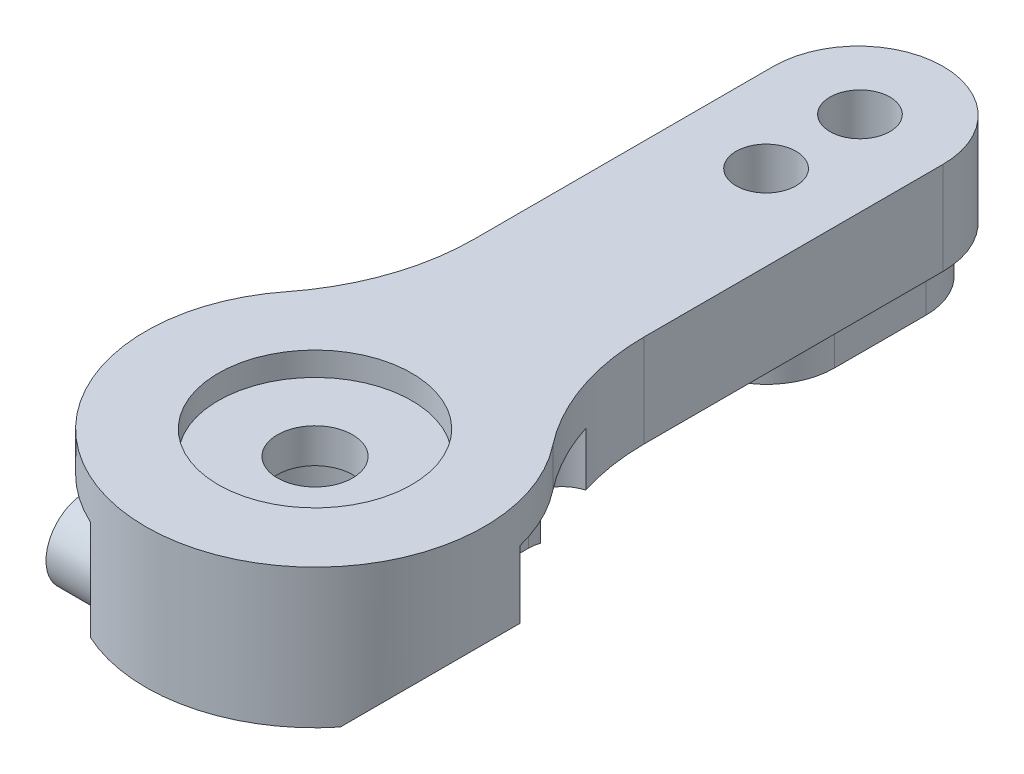
ISO-10303-21;
HEADER;
FILE_DESCRIPTION(('STEP AP214'),'2;1');
FILE_NAME('part.step','',(''),(''),'','','');
FILE_SCHEMA(('AUTOMOTIVE_DESIGN { 1 0 10303 214 1 1 1 1 }'));
ENDSEC;
DATA;
#1=APPLICATION_CONTEXT('core data for automotive mechanical design processes');
#2=APPLICATION_PROTOCOL_DEFINITION('international standard','automotive_design',2000,#1);
#3=PRODUCT_CONTEXT('',#1,'mechanical');
#4=PRODUCT('Part','Part','',(#3));
#5=PRODUCT_RELATED_PRODUCT_CATEGORY('part','',(#4));
#6=PRODUCT_DEFINITION_FORMATION('','',#4);
#7=PRODUCT_DEFINITION_CONTEXT('part definition',#1,'design');
#8=PRODUCT_DEFINITION('design','',#6,#7);
#9=PRODUCT_DEFINITION_SHAPE('','',#8);
#10=(LENGTH_UNIT() NAMED_UNIT(*) SI_UNIT(.MILLI.,.METRE.));
#11=(NAMED_UNIT(*) PLANE_ANGLE_UNIT() SI_UNIT($,.RADIAN.));
#12=(NAMED_UNIT(*) SI_UNIT($,.STERADIAN.) SOLID_ANGLE_UNIT());
#13=UNCERTAINTY_MEASURE_WITH_UNIT(LENGTH_MEASURE(1.E-05),#10,'distance_accuracy_value','');
#14=(GEOMETRIC_REPRESENTATION_CONTEXT(3) GLOBAL_UNCERTAINTY_ASSIGNED_CONTEXT((#13)) GLOBAL_UNIT_ASSIGNED_CONTEXT((#10,
#11,#12)) REPRESENTATION_CONTEXT('',''));
#15=CARTESIAN_POINT('',(0.,0.,0.));
#16=DIRECTION('',(0.,0.,1.));
#17=DIRECTION('',(1.,0.,0.));
#18=AXIS2_PLACEMENT_3D('',#15,#16,#17);
#19=CARTESIAN_POINT('',(-4.635,4.42,3.29740358857448));
#20=DIRECTION('',(0.,-1.,0.));
#21=DIRECTION('',(0.,0.,-1.));
#22=AXIS2_PLACEMENT_3D('',#19,#20,#21);
#23=CYLINDRICAL_SURFACE('',#22,1.5);
#24=CARTESIAN_POINT('',(-3.135,2.37563142999579,3.29740358857448));
#25=CARTESIAN_POINT('',(-3.13499929063332,2.35098734940492,3.29079812653025));
#26=CARTESIAN_POINT('',(-3.13501076060452,2.32619946416548,3.2847292713313));
#27=CARTESIAN_POINT('',(-3.13505593108993,2.27638334594961,3.2736746323766));
#28=CARTESIAN_POINT('',(-3.13508963162104,2.25135511279069,3.26868884944323));
#29=CARTESIAN_POINT('',(-3.1351771351546,2.20110555970957,3.25981021609176));
#30=CARTESIAN_POINT('',(-3.1352309381876,2.17588423949419,3.25591736733339));
#31=CARTESIAN_POINT('',(-3.13536928706567,2.12529609720727,3.24923184705765));
#32=CARTESIAN_POINT('',(-3.13545383298078,2.09992927480443,3.24643917804637));
#33=CARTESIAN_POINT('',(-3.13561323409808,2.04909860768838,3.24195932813421));
#34=CARTESIAN_POINT('',(-3.13568808927085,2.02363476268074,3.24027215059089));
#35=CARTESIAN_POINT('',(-3.13597920321424,1.9726562761898,3.23800646686057));
#36=CARTESIAN_POINT('',(-3.1361954625217,1.94714163451402,3.23742796488258));
#37=CARTESIAN_POINT('',(-3.13620055637309,1.92108625176765,3.2374038399132));
#38=CARTESIAN_POINT('',(-3.13620056680338,1.92054312652284,3.23740358850619));
#39=CARTESIAN_POINT('',(-3.13619646691662,1.89477615854863,3.23740359174605));
#40=CARTESIAN_POINT('',(-3.13598356368196,1.86954956056594,3.237945990029));
#41=CARTESIAN_POINT('',(-3.13569268980616,1.8186280810411,3.24013682474229));
#42=CARTESIAN_POINT('',(-3.13561757173885,1.79293418928827,3.24180768425076));
#43=CARTESIAN_POINT('',(-3.13545721413209,1.7416749322182,3.24627218493815));
#44=CARTESIAN_POINT('',(-3.1353719869119,1.71610944924568,3.24906446923085));
#45=CARTESIAN_POINT('',(-3.13523260986903,1.66515617498853,3.2557623679507));
#46=CARTESIAN_POINT('',(-3.13517842265874,1.63976820646996,3.259666634471));
#47=CARTESIAN_POINT('',(-3.13509030285911,1.58921794481394,3.26857710349415));
#48=CARTESIAN_POINT('',(-3.13505634588633,1.56405541614981,3.27358196944118));
#49=CARTESIAN_POINT('',(-3.13501084968834,1.51400331526107,3.28467963063528));
#50=CARTESIAN_POINT('',(-3.13499928342199,1.48911344992846,3.29077110386569));
#51=CARTESIAN_POINT('',(-3.135,1.46436857000421,3.29740358857448));
#52=B_SPLINE_CURVE_WITH_KNOTS('',3,(#24,#25,#26,#27,#28,#29,#30,#31,#32,#33,#34,#35,#36,#37,#38,
#39,#40,#41,#42,#43,#44,#45,#46,#47,#48,#49,#50,#51),.UNSPECIFIED.,.F.,.F.,(4,2,2,2,2,2,2,2,2,2,
2,2,2,4),(0.,0.076535864251509,0.153071786616124,0.22960782520736,0.306144038138464,
0.38268048352229,0.459217219471158,0.46084659773949,0.536518061710102,0.613739201524309,
0.690867186509442,0.767902074613317,0.844843923994357,0.921692793022475),.UNSPECIFIED.);
#53=CARTESIAN_POINT('',(-3.135,2.37563142999579,3.29740358857448));
#54=VERTEX_POINT('',#53);
#55=CARTESIAN_POINT('',(-3.135,1.46436857000421,3.29740358857448));
#56=VERTEX_POINT('',#55);
#57=EDGE_CURVE('E11',#54,#56,#52,.T.);
#58=ORIENTED_EDGE('',*,*,#57,.F.);
#59=DIRECTION('',(0.,-1.,0.));
#60=VECTOR('',#59,1.);
#61=CARTESIAN_POINT('',(-3.135,4.42,3.29740358857448));
#62=LINE('',#61,#60);
#63=CARTESIAN_POINT('',(-3.135,4.42,3.29740358857448));
#64=VERTEX_POINT('',#63);
#65=EDGE_CURVE('E197',#64,#54,#62,.T.);
#66=ORIENTED_EDGE('',*,*,#65,.F.);
#67=CARTESIAN_POINT('',(-4.635,4.42,3.29740358857448));
#68=DIRECTION('',(0.,-1.,0.));
#69=DIRECTION('',(0.,0.,-1.));
#70=AXIS2_PLACEMENT_3D('',#67,#68,#69);
#71=CIRCLE('',#70,1.5);
#72=CARTESIAN_POINT('',(-4.635,4.42,1.79740358857448));
#73=VERTEX_POINT('',#72);
#74=EDGE_CURVE('E463',#73,#64,#71,.T.);
#75=ORIENTED_EDGE('',*,*,#74,.F.);
#76=DIRECTION('',(0.,-1.,0.));
#77=VECTOR('',#76,1.);
#78=CARTESIAN_POINT('',(-4.635,4.42,1.79740358857448));
#79=LINE('',#78,#77);
#80=CARTESIAN_POINT('',(-4.635,0.,1.79740358857448));
#81=VERTEX_POINT('',#80);
#82=EDGE_CURVE('E198',#73,#81,#79,.T.);
#83=ORIENTED_EDGE('',*,*,#82,.T.);
#84=CARTESIAN_POINT('',(-4.635,0.,3.29740358857448));
#85=DIRECTION('',(0.,-1.,0.));
#86=DIRECTION('',(0.,0.,-1.));
#87=AXIS2_PLACEMENT_3D('',#84,#85,#86);
#88=CIRCLE('',#87,1.5);
#89=CARTESIAN_POINT('',(-3.135,0.,3.29740358857448));
#90=VERTEX_POINT('',#89);
#91=EDGE_CURVE('E194',#81,#90,#88,.T.);
#92=ORIENTED_EDGE('',*,*,#91,.T.);
#93=EDGE_CURVE('E40',#56,#90,#62,.T.);
#94=ORIENTED_EDGE('',*,*,#93,.F.);
#95=EDGE_LOOP('',(#58,#66,#75,#83,#92,#94));
#96=FACE_BOUND('',#95,.T.);
#97=ADVANCED_FACE('F36',(#96),#23,.F.);
#98=CARTESIAN_POINT('',(0.,0.,0.));
#99=DIRECTION('',(0.,1.,0.));
#100=DIRECTION('',(0.,0.,1.));
#101=AXIS2_PLACEMENT_3D('',#98,#99,#100);
#102=CYLINDRICAL_SURFACE('',#101,1.66);
#103=CARTESIAN_POINT('',(0.,5.1,0.));
#104=DIRECTION('',(0.,1.,0.));
#105=DIRECTION('',(0.,0.,1.));
#106=AXIS2_PLACEMENT_3D('',#103,#104,#105);
#107=CIRCLE('',#106,1.66);
#108=CARTESIAN_POINT('',(0.,5.1,1.66));
#109=VERTEX_POINT('',#108);
#110=EDGE_CURVE('E321',#109,#109,#107,.T.);
#111=ORIENTED_EDGE('',*,*,#110,.T.);
#112=EDGE_LOOP('',(#111));
#113=FACE_BOUND('',#112,.T.);
#114=CARTESIAN_POINT('',(0.,3.57,0.));
#115=DIRECTION('',(0.,-1.,0.));
#116=DIRECTION('',(0.,0.,-1.));
#117=AXIS2_PLACEMENT_3D('',#114,#115,#116);
#118=CIRCLE('',#117,1.66);
#119=CARTESIAN_POINT('',(0.,3.57,-1.66));
#120=VERTEX_POINT('',#119);
#121=EDGE_CURVE('E422',#120,#120,#118,.F.);
#122=ORIENTED_EDGE('',*,*,#121,.F.);
#123=EDGE_LOOP('',(#122));
#124=FACE_BOUND('',#123,.T.);
#125=ADVANCED_FACE('F265',(#113,#124),#102,.F.);
#126=CARTESIAN_POINT('',(0.,2.05,0.));
#127=DIRECTION('',(0.,-1.,0.));
#128=DIRECTION('',(0.,0.,-1.));
#129=AXIS2_PLACEMENT_3D('',#126,#127,#128);
#130=CYLINDRICAL_SURFACE('',#129,7.485);
#131=CARTESIAN_POINT('',(0.,2.05,0.));
#132=DIRECTION('',(0.,1.,0.));
#133=DIRECTION('',(0.,0.,1.));
#134=AXIS2_PLACEMENT_3D('',#131,#132,#133);
#135=CIRCLE('',#134,7.485);
#136=CARTESIAN_POINT('',(3.20885580441953,2.05,-6.76228285613987));
#137=VERTEX_POINT('',#136);
#138=CARTESIAN_POINT('',(-5.88611667143266,2.05,-4.62372744982688));
#139=VERTEX_POINT('',#138);
#140=EDGE_CURVE('E383',#137,#139,#135,.T.);
#141=ORIENTED_EDGE('',*,*,#140,.F.);
#142=DIRECTION('',(0.,-1.,0.));
#143=VECTOR('',#142,1.);
#144=CARTESIAN_POINT('',(3.20885580441953,2.21,-6.76228285613987));
#145=LINE('',#144,#143);
#146=CARTESIAN_POINT('',(3.20885580441953,0.,-6.76228285613987));
#147=VERTEX_POINT('',#146);
#148=EDGE_CURVE('E296',#137,#147,#145,.T.);
#149=ORIENTED_EDGE('',*,*,#148,.T.);
#150=CARTESIAN_POINT('',(0.,0.,0.));
#151=DIRECTION('',(0.,1.,0.));
#152=DIRECTION('',(0.,0.,1.));
#153=AXIS2_PLACEMENT_3D('',#150,#151,#152);
#154=CIRCLE('',#153,7.485);
#155=CARTESIAN_POINT('',(-5.82329906421162,0.,-4.70259641142552));
#156=VERTEX_POINT('',#155);
#157=EDGE_CURVE('E386',#147,#156,#154,.T.);
#158=ORIENTED_EDGE('',*,*,#157,.T.);
#159=CARTESIAN_POINT('',(0.,-5.82329906421164,0.));
#160=DIRECTION('',(-0.707106781186549,-0.707106781186546,0.));
#161=DIRECTION('',(0.707106781186546,-0.707106781186549,0.));
#162=AXIS2_PLACEMENT_3D('',#159,#160,#161);
#163=ELLIPSE('',#162,10.5853885143626,7.485);
#164=CARTESIAN_POINT('',(-7.26598687996198,1.44268781575037,1.79740358857448));
#165=VERTEX_POINT('',#164);
#166=EDGE_CURVE('E302',#165,#156,#163,.T.);
#167=ORIENTED_EDGE('',*,*,#166,.F.);
#168=DIRECTION('',(0.,-1.,0.));
#169=VECTOR('',#168,1.);
#170=CARTESIAN_POINT('',(-7.26598687996198,2.05,1.79740358857448));
#171=LINE('',#170,#169);
#172=CARTESIAN_POINT('',(-7.26598687996198,4.42,1.79740358857448));
#173=VERTEX_POINT('',#172);
#174=EDGE_CURVE('E285',#165,#173,#171,.F.);
#175=ORIENTED_EDGE('',*,*,#174,.T.);
#176=CARTESIAN_POINT('',(0.,4.42,0.));
#177=DIRECTION('',(0.,-1.,0.));
#178=DIRECTION('',(0.,0.,-1.));
#179=AXIS2_PLACEMENT_3D('',#176,#177,#178);
#180=CIRCLE('',#179,7.485);
#181=CARTESIAN_POINT('',(-3.135,4.42,6.79683749989655));
#182=VERTEX_POINT('',#181);
#183=EDGE_CURVE('E46',#182,#173,#180,.T.);
#184=ORIENTED_EDGE('',*,*,#183,.F.);
#185=DIRECTION('',(0.,-1.,0.));
#186=VECTOR('',#185,1.);
#187=CARTESIAN_POINT('',(-3.135,2.05,6.79683749989655));
#188=LINE('',#187,#186);
#189=CARTESIAN_POINT('',(-3.135,0.,6.79683749989655));
#190=VERTEX_POINT('',#189);
#191=EDGE_CURVE('E299',#182,#190,#188,.T.);
#192=ORIENTED_EDGE('',*,*,#191,.T.);
#193=CARTESIAN_POINT('',(5.82329906421162,0.,4.70259641142551));
#194=VERTEX_POINT('',#193);
#195=EDGE_CURVE('E380',#190,#194,#154,.T.);
#196=ORIENTED_EDGE('',*,*,#195,.T.);
#197=CARTESIAN_POINT('',(0.,-5.82329906421164,0.));
#198=DIRECTION('',(-0.707106781186549,0.707106781186546,0.));
#199=DIRECTION('',(-0.707106781186546,-0.707106781186549,0.));
#200=AXIS2_PLACEMENT_3D('',#197,#198,#199);
#201=ELLIPSE('',#200,10.5853885143626,7.485);
#202=CARTESIAN_POINT('',(7.26598687996198,1.44268781575037,-1.79740358857448));
#203=VERTEX_POINT('',#202);
#204=EDGE_CURVE('E305',#194,#203,#201,.T.);
#205=ORIENTED_EDGE('',*,*,#204,.T.);
#206=DIRECTION('',(0.,-1.,0.));
#207=VECTOR('',#206,1.);
#208=CARTESIAN_POINT('',(7.26598687996197,2.05,-1.79740358857449));
#209=LINE('',#208,#207);
#210=CARTESIAN_POINT('',(7.26598687996197,4.42,-1.79740358857449));
#211=VERTEX_POINT('',#210);
#212=EDGE_CURVE('E60',#203,#211,#209,.F.);
#213=ORIENTED_EDGE('',*,*,#212,.T.);
#214=CARTESIAN_POINT('',(0.,4.42,0.));
#215=DIRECTION('',(0.,1.,0.));
#216=DIRECTION('',(0.,0.,1.));
#217=AXIS2_PLACEMENT_3D('',#214,#215,#216);
#218=CIRCLE('',#217,7.485);
#219=CARTESIAN_POINT('',(5.88611667143266,4.42,-4.62372744982688));
#220=VERTEX_POINT('',#219);
#221=EDGE_CURVE('E290',#211,#220,#218,.T.);
#222=ORIENTED_EDGE('',*,*,#221,.T.);
#223=DIRECTION('',(0.,-1.,0.));
#224=VECTOR('',#223,1.);
#225=CARTESIAN_POINT('',(5.88611667143266,2.05,-4.62372744982688));
#226=LINE('',#225,#224);
#227=CARTESIAN_POINT('',(5.88611667143266,6.15,-4.62372744982688));
#228=VERTEX_POINT('',#227);
#229=EDGE_CURVE('E385',#220,#228,#226,.F.);
#230=ORIENTED_EDGE('',*,*,#229,.T.);
#231=CARTESIAN_POINT('',(0.,6.15,0.));
#232=DIRECTION('',(0.,1.,0.));
#233=DIRECTION('',(0.,0.,1.));
#234=AXIS2_PLACEMENT_3D('',#231,#232,#233);
#235=CIRCLE('',#234,7.485);
#236=CARTESIAN_POINT('',(-5.88611667143266,6.15,-4.62372744982688));
#237=VERTEX_POINT('',#236);
#238=EDGE_CURVE('E368',#237,#228,#235,.T.);
#239=ORIENTED_EDGE('',*,*,#238,.F.);
#240=DIRECTION('',(0.,-1.,0.));
#241=VECTOR('',#240,1.);
#242=CARTESIAN_POINT('',(-5.88611667143266,2.05,-4.62372744982688));
#243=LINE('',#242,#241);
#244=EDGE_CURVE('E389',#237,#139,#243,.T.);
#245=ORIENTED_EDGE('',*,*,#244,.T.);
#246=EDGE_LOOP('',(#141,#149,#158,#167,#175,#184,#192,#196,#205,#213,#222,#230,#239,#245));
#247=FACE_BOUND('',#246,.T.);
#248=ADVANCED_FACE('F472',(#247),#130,.T.);
#249=CARTESIAN_POINT('',(0.,0.,0.));
#250=DIRECTION('',(0.,1.,0.));
#251=DIRECTION('',(0.,0.,1.));
#252=AXIS2_PLACEMENT_3D('',#249,#250,#251);
#253=PLANE('',#252);
#254=CARTESIAN_POINT('',(0.,0.,0.));
#255=DIRECTION('',(0.,-1.,0.));
#256=DIRECTION('',(0.,0.,-1.));
#257=AXIS2_PLACEMENT_3D('',#254,#255,#256);
#258=CIRCLE('',#257,3.);
#259=CARTESIAN_POINT('',(0.,0.,-3.));
#260=VERTEX_POINT('',#259);
#261=EDGE_CURVE('E430',#260,#260,#258,.T.);
#262=ORIENTED_EDGE('',*,*,#261,.F.);
#263=EDGE_LOOP('',(#262));
#264=FACE_BOUND('',#263,.T.);
#265=ORIENTED_EDGE('',*,*,#157,.F.);
#266=CARTESIAN_POINT('',(4.635,0.,-6.29740358857449));
#267=DIRECTION('',(0.,-1.,0.));
#268=DIRECTION('',(0.,0.,1.));
#269=AXIS2_PLACEMENT_3D('',#266,#267,#268);
#270=CIRCLE('',#269,1.5);
#271=CARTESIAN_POINT('',(3.135,0.,-6.29740358857449));
#272=VERTEX_POINT('',#271);
#273=EDGE_CURVE('E438',#272,#147,#270,.T.);
#274=ORIENTED_EDGE('',*,*,#273,.F.);
#275=DIRECTION('',(0.,0.,-1.));
#276=VECTOR('',#275,1.);
#277=CARTESIAN_POINT('',(3.135,0.,-3.29740358857449));
#278=LINE('',#277,#276);
#279=CARTESIAN_POINT('',(3.135,0.,-3.29740358857449));
#280=VERTEX_POINT('',#279);
#281=EDGE_CURVE('E452',#280,#272,#278,.T.);
#282=ORIENTED_EDGE('',*,*,#281,.F.);
#283=CARTESIAN_POINT('',(4.635,0.,-3.29740358857449));
#284=DIRECTION('',(0.,-1.,0.));
#285=DIRECTION('',(0.,0.,-1.));
#286=AXIS2_PLACEMENT_3D('',#283,#284,#285);
#287=CIRCLE('',#286,1.5);
#288=CARTESIAN_POINT('',(4.635,0.,-1.79740358857449));
#289=VERTEX_POINT('',#288);
#290=EDGE_CURVE('E449',#289,#280,#287,.T.);
#291=ORIENTED_EDGE('',*,*,#290,.F.);
#292=DIRECTION('',(-1.,0.,0.));
#293=VECTOR('',#292,1.);
#294=CARTESIAN_POINT('',(21.720467250283,0.,-1.79740358857449));
#295=LINE('',#294,#293);
#296=CARTESIAN_POINT('',(5.82329906421162,0.,-1.79740358857449));
#297=VERTEX_POINT('',#296);
#298=EDGE_CURVE('E276',#297,#289,#295,.T.);
#299=ORIENTED_EDGE('',*,*,#298,.F.);
#300=DIRECTION('',(0.,0.,1.));
#301=VECTOR('',#300,1.);
#302=CARTESIAN_POINT('',(5.82329906421162,0.,0.));
#303=LINE('',#302,#301);
#304=EDGE_CURVE('E406',#297,#194,#303,.T.);
#305=ORIENTED_EDGE('',*,*,#304,.T.);
#306=ORIENTED_EDGE('',*,*,#195,.F.);
#307=DIRECTION('',(0.,0.,1.));
#308=VECTOR('',#307,1.);
#309=CARTESIAN_POINT('',(-3.135,0.,3.29740358857448));
#310=LINE('',#309,#308);
#311=EDGE_CURVE('E280',#90,#190,#310,.T.);
#312=ORIENTED_EDGE('',*,*,#311,.F.);
#313=ORIENTED_EDGE('',*,*,#91,.F.);
#314=DIRECTION('',(1.,0.,0.));
#315=VECTOR('',#314,1.);
#316=CARTESIAN_POINT('',(-4.635,0.,1.79740358857448));
#317=LINE('',#316,#315);
#318=CARTESIAN_POINT('',(-5.82329906421162,0.,1.79740358857448));
#319=VERTEX_POINT('',#318);
#320=EDGE_CURVE('E424',#319,#81,#317,.T.);
#321=ORIENTED_EDGE('',*,*,#320,.F.);
#322=DIRECTION('',(0.,0.,1.));
#323=VECTOR('',#322,1.);
#324=CARTESIAN_POINT('',(-5.82329906421162,0.,0.));
#325=LINE('',#324,#323);
#326=EDGE_CURVE('E409',#156,#319,#325,.T.);
#327=ORIENTED_EDGE('',*,*,#326,.F.);
#328=EDGE_LOOP('',(#265,#274,#282,#291,#299,#305,#306,#312,#313,#321,#327));
#329=FACE_BOUND('',#328,.T.);
#330=ADVANCED_FACE('F474',(#264,#329),#253,.F.);
#331=CARTESIAN_POINT('',(0.,2.05,-24.015));
#332=DIRECTION('',(0.,1.,0.));
#333=DIRECTION('',(0.,0.,1.));
#334=AXIS2_PLACEMENT_3D('',#331,#332,#333);
#335=PLANE('',#334);
#336=DIRECTION('',(0.,0.,1.));
#337=VECTOR('',#336,1.);
#338=CARTESIAN_POINT('',(-2.99999999999999,2.05,0.));
#339=LINE('',#338,#337);
#340=CARTESIAN_POINT('',(-3.,2.05,-24.015));
#341=VERTEX_POINT('',#340);
#342=CARTESIAN_POINT('',(-3.,2.05,-19.955));
#343=VERTEX_POINT('',#342);
#344=EDGE_CURVE('E330',#341,#343,#339,.T.);
#345=ORIENTED_EDGE('',*,*,#344,.T.);
#346=CARTESIAN_POINT('',(0.,2.05,-19.955));
#347=DIRECTION('',(0.,1.,0.));
#348=DIRECTION('',(0.,0.,1.));
#349=AXIS2_PLACEMENT_3D('',#346,#347,#348);
#350=CIRCLE('',#349,3.);
#351=CARTESIAN_POINT('',(3.,2.05,-19.955));
#352=VERTEX_POINT('',#351);
#353=EDGE_CURVE('E332',#343,#352,#350,.T.);
#354=ORIENTED_EDGE('',*,*,#353,.T.);
#355=DIRECTION('',(0.,0.,1.));
#356=VECTOR('',#355,1.);
#357=CARTESIAN_POINT('',(2.99999999999999,2.05,0.));
#358=LINE('',#357,#356);
#359=CARTESIAN_POINT('',(3.,2.05,-24.015));
#360=VERTEX_POINT('',#359);
#361=EDGE_CURVE('E335',#360,#352,#358,.T.);
#362=ORIENTED_EDGE('',*,*,#361,.F.);
#363=CARTESIAN_POINT('',(0.,2.05,-24.015));
#364=DIRECTION('',(0.,1.,0.));
#365=DIRECTION('',(0.,0.,1.));
#366=AXIS2_PLACEMENT_3D('',#363,#364,#365);
#367=CIRCLE('',#366,3.);
#368=EDGE_CURVE('E338',#360,#341,#367,.T.);
#369=ORIENTED_EDGE('',*,*,#368,.T.);
#370=EDGE_LOOP('',(#345,#354,#362,#369));
#371=FACE_BOUND('',#370,.T.);
#372=CARTESIAN_POINT('',(13.75,2.05,-10.8010520320939));
#373=DIRECTION('',(0.,1.,0.));
#374=DIRECTION('',(0.,0.,1.));
#375=AXIS2_PLACEMENT_3D('',#372,#373,#374);
#376=CIRCLE('',#375,10.);
#377=CARTESIAN_POINT('',(3.75,2.05,-10.8010520320939));
#378=VERTEX_POINT('',#377);
#379=CARTESIAN_POINT('',(4.22952167045125,2.05,-7.7415598558345));
#380=VERTEX_POINT('',#379);
#381=EDGE_CURVE('E401',#378,#380,#376,.T.);
#382=ORIENTED_EDGE('',*,*,#381,.T.);
#383=CARTESIAN_POINT('',(4.635,2.05,-6.29740358857449));
#384=DIRECTION('',(0.,1.,0.));
#385=DIRECTION('',(0.,0.,1.));
#386=AXIS2_PLACEMENT_3D('',#383,#384,#385);
#387=CIRCLE('',#386,1.5);
#388=EDGE_CURVE('E293',#380,#137,#387,.T.);
#389=ORIENTED_EDGE('',*,*,#388,.T.);
#390=ORIENTED_EDGE('',*,*,#140,.T.);
#391=CARTESIAN_POINT('',(-13.75,2.05,-10.8010520320939));
#392=DIRECTION('',(0.,1.,0.));
#393=DIRECTION('',(0.,0.,1.));
#394=AXIS2_PLACEMENT_3D('',#391,#392,#393);
#395=CIRCLE('',#394,10.);
#396=CARTESIAN_POINT('',(-3.75,2.05,-10.8010520320939));
#397=VERTEX_POINT('',#396);
#398=EDGE_CURVE('E397',#139,#397,#395,.T.);
#399=ORIENTED_EDGE('',*,*,#398,.T.);
#400=DIRECTION('',(0.,0.,-1.));
#401=VECTOR('',#400,1.);
#402=CARTESIAN_POINT('',(-3.75,2.05,0.));
#403=LINE('',#402,#401);
#404=CARTESIAN_POINT('',(-3.75,2.05,-24.015));
#405=VERTEX_POINT('',#404);
#406=EDGE_CURVE('E359',#397,#405,#403,.T.);
#407=ORIENTED_EDGE('',*,*,#406,.T.);
#408=CARTESIAN_POINT('',(0.,2.05,-24.015));
#409=DIRECTION('',(0.,1.,0.));
#410=DIRECTION('',(0.,0.,1.));
#411=AXIS2_PLACEMENT_3D('',#408,#409,#410);
#412=CIRCLE('',#411,3.75);
#413=CARTESIAN_POINT('',(3.75,2.05,-24.015));
#414=VERTEX_POINT('',#413);
#415=EDGE_CURVE('E373',#414,#405,#412,.T.);
#416=ORIENTED_EDGE('',*,*,#415,.F.);
#417=DIRECTION('',(0.,0.,-1.));
#418=VECTOR('',#417,1.);
#419=CARTESIAN_POINT('',(3.75,2.05,0.));
#420=LINE('',#419,#418);
#421=EDGE_CURVE('E363',#378,#414,#420,.T.);
#422=ORIENTED_EDGE('',*,*,#421,.F.);
#423=EDGE_LOOP('',(#382,#389,#390,#399,#407,#416,#422));
#424=FACE_BOUND('',#423,.T.);
#425=ADVANCED_FACE('F507',(#371,#424),#335,.F.);
#426=CARTESIAN_POINT('',(-3.75,6.15,0.));
#427=DIRECTION('',(-1.,0.,0.));
#428=DIRECTION('',(0.,0.,1.));
#429=AXIS2_PLACEMENT_3D('',#426,#427,#428);
#430=PLANE('',#429);
#431=ORIENTED_EDGE('',*,*,#406,.F.);
#432=DIRECTION('',(0.,-1.,0.));
#433=VECTOR('',#432,1.);
#434=CARTESIAN_POINT('',(-3.75,6.15,-10.8010520320939));
#435=LINE('',#434,#433);
#436=CARTESIAN_POINT('',(-3.75,6.15,-10.8010520320939));
#437=VERTEX_POINT('',#436);
#438=EDGE_CURVE('E392',#397,#437,#435,.F.);
#439=ORIENTED_EDGE('',*,*,#438,.T.);
#440=DIRECTION('',(0.,0.,-1.));
#441=VECTOR('',#440,1.);
#442=CARTESIAN_POINT('',(-3.75,6.15,0.));
#443=LINE('',#442,#441);
#444=CARTESIAN_POINT('',(-3.75,6.15,-24.015));
#445=VERTEX_POINT('',#444);
#446=EDGE_CURVE('E360',#437,#445,#443,.T.);
#447=ORIENTED_EDGE('',*,*,#446,.T.);
#448=DIRECTION('',(0.,-1.,0.));
#449=VECTOR('',#448,1.);
#450=CARTESIAN_POINT('',(-3.75,6.15,-24.015));
#451=LINE('',#450,#449);
#452=EDGE_CURVE('E371',#445,#405,#451,.T.);
#453=ORIENTED_EDGE('',*,*,#452,.T.);
#454=EDGE_LOOP('',(#431,#439,#447,#453));
#455=FACE_BOUND('',#454,.T.);
#456=ADVANCED_FACE('F640',(#455),#430,.T.);
#457=CARTESIAN_POINT('',(3.75,6.15,0.));
#458=DIRECTION('',(-1.,0.,0.));
#459=DIRECTION('',(0.,0.,1.));
#460=AXIS2_PLACEMENT_3D('',#457,#458,#459);
#461=PLANE('',#460);
#462=DIRECTION('',(0.,0.,-1.));
#463=VECTOR('',#462,1.);
#464=CARTESIAN_POINT('',(3.75,6.15,0.));
#465=LINE('',#464,#463);
#466=CARTESIAN_POINT('',(3.75,6.15,-10.8010520320939));
#467=VERTEX_POINT('',#466);
#468=CARTESIAN_POINT('',(3.75,6.15,-24.015));
#469=VERTEX_POINT('',#468);
#470=EDGE_CURVE('E366',#467,#469,#465,.T.);
#471=ORIENTED_EDGE('',*,*,#470,.F.);
#472=DIRECTION('',(0.,1.,0.));
#473=VECTOR('',#472,1.);
#474=CARTESIAN_POINT('',(3.75,2.05,-10.8010520320939));
#475=LINE('',#474,#473);
#476=EDGE_CURVE('E394',#467,#378,#475,.F.);
#477=ORIENTED_EDGE('',*,*,#476,.T.);
#478=ORIENTED_EDGE('',*,*,#421,.T.);
#479=DIRECTION('',(0.,-1.,0.));
#480=VECTOR('',#479,1.);
#481=CARTESIAN_POINT('',(3.75,6.15,-24.015));
#482=LINE('',#481,#480);
#483=EDGE_CURVE('E377',#469,#414,#482,.T.);
#484=ORIENTED_EDGE('',*,*,#483,.F.);
#485=EDGE_LOOP('',(#471,#477,#478,#484));
#486=FACE_BOUND('',#485,.T.);
#487=ADVANCED_FACE('F492',(#486),#461,.F.);
#488=CARTESIAN_POINT('',(0.,6.15,-24.015));
#489=DIRECTION('',(0.,-1.,0.));
#490=DIRECTION('',(0.,0.,-1.));
#491=AXIS2_PLACEMENT_3D('',#488,#489,#490);
#492=CYLINDRICAL_SURFACE('',#491,3.75);
#493=ORIENTED_EDGE('',*,*,#415,.T.);
#494=ORIENTED_EDGE('',*,*,#452,.F.);
#495=CARTESIAN_POINT('',(0.,6.15,-24.015));
#496=DIRECTION('',(0.,1.,0.));
#497=DIRECTION('',(0.,0.,1.));
#498=AXIS2_PLACEMENT_3D('',#495,#496,#497);
#499=CIRCLE('',#498,3.75);
#500=EDGE_CURVE('E362',#469,#445,#499,.T.);
#501=ORIENTED_EDGE('',*,*,#500,.F.);
#502=ORIENTED_EDGE('',*,*,#483,.T.);
#503=EDGE_LOOP('',(#493,#494,#501,#502));
#504=FACE_BOUND('',#503,.T.);
#505=ADVANCED_FACE('F498',(#504),#492,.T.);
#506=CARTESIAN_POINT('',(0.,6.15,-24.015));
#507=DIRECTION('',(0.,1.,0.));
#508=DIRECTION('',(0.,0.,1.));
#509=AXIS2_PLACEMENT_3D('',#506,#507,#508);
#510=PLANE('',#509);
#511=CARTESIAN_POINT('',(0.,6.15,-19.94));
#512=DIRECTION('',(0.,-1.,0.));
#513=DIRECTION('',(0.,0.,-1.));
#514=AXIS2_PLACEMENT_3D('',#511,#512,#513);
#515=CIRCLE('',#514,1.325);
#516=CARTESIAN_POINT('',(0.,6.15,-21.265));
#517=VERTEX_POINT('',#516);
#518=EDGE_CURVE('E309',#517,#517,#515,.T.);
#519=ORIENTED_EDGE('',*,*,#518,.T.);
#520=EDGE_LOOP('',(#519));
#521=FACE_BOUND('',#520,.T.);
#522=CARTESIAN_POINT('',(0.,6.15,-24.09));
#523=DIRECTION('',(0.,-1.,0.));
#524=DIRECTION('',(0.,0.,-1.));
#525=AXIS2_PLACEMENT_3D('',#522,#523,#524);
#526=CIRCLE('',#525,1.325);
#527=CARTESIAN_POINT('',(0.,6.15,-25.415));
#528=VERTEX_POINT('',#527);
#529=EDGE_CURVE('E316',#528,#528,#526,.T.);
#530=ORIENTED_EDGE('',*,*,#529,.T.);
#531=EDGE_LOOP('',(#530));
#532=FACE_BOUND('',#531,.T.);
#533=CARTESIAN_POINT('',(0.,6.15,0.));
#534=DIRECTION('',(0.,1.,0.));
#535=DIRECTION('',(0.,0.,1.));
#536=AXIS2_PLACEMENT_3D('',#533,#534,#535);
#537=CIRCLE('',#536,4.275);
#538=CARTESIAN_POINT('',(0.,6.15,4.275));
#539=VERTEX_POINT('',#538);
#540=EDGE_CURVE('E312',#539,#539,#537,.T.);
#541=ORIENTED_EDGE('',*,*,#540,.F.);
#542=EDGE_LOOP('',(#541));
#543=FACE_BOUND('',#542,.T.);
#544=ORIENTED_EDGE('',*,*,#446,.F.);
#545=CARTESIAN_POINT('',(-13.75,6.15,-10.8010520320939));
#546=DIRECTION('',(0.,1.,0.));
#547=DIRECTION('',(0.,0.,1.));
#548=AXIS2_PLACEMENT_3D('',#545,#546,#547);
#549=CIRCLE('',#548,10.);
#550=EDGE_CURVE('E399',#437,#237,#549,.F.);
#551=ORIENTED_EDGE('',*,*,#550,.T.);
#552=ORIENTED_EDGE('',*,*,#238,.T.);
#553=CARTESIAN_POINT('',(13.75,6.15,-10.8010520320939));
#554=DIRECTION('',(0.,1.,0.));
#555=DIRECTION('',(0.,0.,1.));
#556=AXIS2_PLACEMENT_3D('',#553,#554,#555);
#557=CIRCLE('',#556,10.);
#558=EDGE_CURVE('E404',#228,#467,#557,.F.);
#559=ORIENTED_EDGE('',*,*,#558,.T.);
#560=ORIENTED_EDGE('',*,*,#470,.T.);
#561=ORIENTED_EDGE('',*,*,#500,.T.);
#562=EDGE_LOOP('',(#544,#551,#552,#559,#560,#561));
#563=FACE_BOUND('',#562,.T.);
#564=ADVANCED_FACE('F489',(#521,#532,#543,#563),#510,.T.);
#565=CARTESIAN_POINT('',(-2.99999999999999,2.05,0.));
#566=DIRECTION('',(1.,0.,0.));
#567=DIRECTION('',(0.,0.,-1.));
#568=AXIS2_PLACEMENT_3D('',#565,#566,#567);
#569=PLANE('',#568);
#570=DIRECTION('',(0.,0.,1.));
#571=VECTOR('',#570,1.);
#572=CARTESIAN_POINT('',(-2.99999999999999,0.,0.));
#573=LINE('',#572,#571);
#574=CARTESIAN_POINT('',(-3.,0.,-24.015));
#575=VERTEX_POINT('',#574);
#576=CARTESIAN_POINT('',(-3.,0.,-19.955));
#577=VERTEX_POINT('',#576);
#578=EDGE_CURVE('E327',#575,#577,#573,.T.);
#579=ORIENTED_EDGE('',*,*,#578,.T.);
#580=DIRECTION('',(0.,-1.,0.));
#581=VECTOR('',#580,1.);
#582=CARTESIAN_POINT('',(-3.,2.05,-19.955));
#583=LINE('',#582,#581);
#584=EDGE_CURVE('E356',#343,#577,#583,.T.);
#585=ORIENTED_EDGE('',*,*,#584,.F.);
#586=ORIENTED_EDGE('',*,*,#344,.F.);
#587=DIRECTION('',(0.,-1.,0.));
#588=VECTOR('',#587,1.);
#589=CARTESIAN_POINT('',(-3.,2.05,-24.015));
#590=LINE('',#589,#588);
#591=EDGE_CURVE('E340',#341,#575,#590,.T.);
#592=ORIENTED_EDGE('',*,*,#591,.T.);
#593=EDGE_LOOP('',(#579,#585,#586,#592));
#594=FACE_BOUND('',#593,.T.);
#595=ADVANCED_FACE('F748',(#594),#569,.F.);
#596=CARTESIAN_POINT('',(0.,2.05,-19.955));
#597=DIRECTION('',(0.,-1.,0.));
#598=DIRECTION('',(0.,0.,-1.));
#599=AXIS2_PLACEMENT_3D('',#596,#597,#598);
#600=CYLINDRICAL_SURFACE('',#599,3.);
#601=CARTESIAN_POINT('',(0.,0.,-19.955));
#602=DIRECTION('',(0.,1.,0.));
#603=DIRECTION('',(0.,0.,1.));
#604=AXIS2_PLACEMENT_3D('',#601,#602,#603);
#605=CIRCLE('',#604,3.);
#606=CARTESIAN_POINT('',(3.,0.,-19.955));
#607=VERTEX_POINT('',#606);
#608=EDGE_CURVE('E343',#577,#607,#605,.T.);
#609=ORIENTED_EDGE('',*,*,#608,.T.);
#610=DIRECTION('',(0.,-1.,0.));
#611=VECTOR('',#610,1.);
#612=CARTESIAN_POINT('',(3.,2.05,-19.955));
#613=LINE('',#612,#611);
#614=EDGE_CURVE('E354',#352,#607,#613,.T.);
#615=ORIENTED_EDGE('',*,*,#614,.F.);
#616=ORIENTED_EDGE('',*,*,#353,.F.);
#617=ORIENTED_EDGE('',*,*,#584,.T.);
#618=EDGE_LOOP('',(#609,#615,#616,#617));
#619=FACE_BOUND('',#618,.T.);
#620=ADVANCED_FACE('F738',(#619),#600,.T.);
#621=CARTESIAN_POINT('',(2.99999999999999,2.05,0.));
#622=DIRECTION('',(1.,0.,0.));
#623=DIRECTION('',(0.,0.,-1.));
#624=AXIS2_PLACEMENT_3D('',#621,#622,#623);
#625=PLANE('',#624);
#626=DIRECTION('',(0.,0.,1.));
#627=VECTOR('',#626,1.);
#628=CARTESIAN_POINT('',(2.99999999999999,0.,0.));
#629=LINE('',#628,#627);
#630=CARTESIAN_POINT('',(3.,0.,-24.015));
#631=VERTEX_POINT('',#630);
#632=EDGE_CURVE('E346',#631,#607,#629,.T.);
#633=ORIENTED_EDGE('',*,*,#632,.F.);
#634=DIRECTION('',(0.,-1.,0.));
#635=VECTOR('',#634,1.);
#636=CARTESIAN_POINT('',(3.,2.05,-24.015));
#637=LINE('',#636,#635);
#638=EDGE_CURVE('E352',#360,#631,#637,.T.);
#639=ORIENTED_EDGE('',*,*,#638,.F.);
#640=ORIENTED_EDGE('',*,*,#361,.T.);
#641=ORIENTED_EDGE('',*,*,#614,.T.);
#642=EDGE_LOOP('',(#633,#639,#640,#641));
#643=FACE_BOUND('',#642,.T.);
#644=ADVANCED_FACE('F727',(#643),#625,.T.);
#645=CARTESIAN_POINT('',(0.,2.05,-24.015));
#646=DIRECTION('',(0.,-1.,0.));
#647=DIRECTION('',(0.,0.,-1.));
#648=AXIS2_PLACEMENT_3D('',#645,#646,#647);
#649=CYLINDRICAL_SURFACE('',#648,3.);
#650=CARTESIAN_POINT('',(0.,0.,-24.015));
#651=DIRECTION('',(0.,1.,0.));
#652=DIRECTION('',(0.,0.,1.));
#653=AXIS2_PLACEMENT_3D('',#650,#651,#652);
#654=CIRCLE('',#653,3.);
#655=EDGE_CURVE('E333',#631,#575,#654,.T.);
#656=ORIENTED_EDGE('',*,*,#655,.T.);
#657=ORIENTED_EDGE('',*,*,#591,.F.);
#658=ORIENTED_EDGE('',*,*,#368,.F.);
#659=ORIENTED_EDGE('',*,*,#638,.T.);
#660=EDGE_LOOP('',(#656,#657,#658,#659));
#661=FACE_BOUND('',#660,.T.);
#662=ADVANCED_FACE('F722',(#661),#649,.T.);
#663=CARTESIAN_POINT('',(0.,0.,0.));
#664=DIRECTION('',(0.,1.,0.));
#665=DIRECTION('',(0.,0.,1.));
#666=AXIS2_PLACEMENT_3D('',#663,#664,#665);
#667=PLANE('',#666);
#668=CARTESIAN_POINT('',(0.,0.,-19.94));
#669=DIRECTION('',(0.,-1.,0.));
#670=DIRECTION('',(0.,0.,-1.));
#671=AXIS2_PLACEMENT_3D('',#668,#669,#670);
#672=CIRCLE('',#671,1.325);
#673=CARTESIAN_POINT('',(0.,0.,-21.265));
#674=VERTEX_POINT('',#673);
#675=EDGE_CURVE('E313',#674,#674,#672,.T.);
#676=ORIENTED_EDGE('',*,*,#675,.F.);
#677=EDGE_LOOP('',(#676));
#678=FACE_BOUND('',#677,.T.);
#679=CARTESIAN_POINT('',(0.,0.,-24.09));
#680=DIRECTION('',(0.,-1.,0.));
#681=DIRECTION('',(0.,0.,-1.));
#682=AXIS2_PLACEMENT_3D('',#679,#680,#681);
#683=CIRCLE('',#682,1.325);
#684=CARTESIAN_POINT('',(0.,0.,-25.415));
#685=VERTEX_POINT('',#684);
#686=EDGE_CURVE('E308',#685,#685,#683,.T.);
#687=ORIENTED_EDGE('',*,*,#686,.F.);
#688=EDGE_LOOP('',(#687));
#689=FACE_BOUND('',#688,.T.);
#690=ORIENTED_EDGE('',*,*,#578,.F.);
#691=ORIENTED_EDGE('',*,*,#655,.F.);
#692=ORIENTED_EDGE('',*,*,#632,.T.);
#693=ORIENTED_EDGE('',*,*,#608,.F.);
#694=EDGE_LOOP('',(#690,#691,#692,#693));
#695=FACE_BOUND('',#694,.T.);
#696=ADVANCED_FACE('F700',(#678,#689,#695),#667,.F.);
#697=CARTESIAN_POINT('',(-13.75,2.05,-10.8010520320939));
#698=DIRECTION('',(0.,-1.,0.));
#699=DIRECTION('',(0.,0.,-1.));
#700=AXIS2_PLACEMENT_3D('',#697,#698,#699);
#701=CYLINDRICAL_SURFACE('',#700,10.);
#702=ORIENTED_EDGE('',*,*,#550,.F.);
#703=ORIENTED_EDGE('',*,*,#438,.F.);
#704=ORIENTED_EDGE('',*,*,#398,.F.);
#705=ORIENTED_EDGE('',*,*,#244,.F.);
#706=EDGE_LOOP('',(#702,#703,#704,#705));
#707=FACE_BOUND('',#706,.T.);
#708=ADVANCED_FACE('F504',(#707),#701,.F.);
#709=CARTESIAN_POINT('',(13.75,2.05,-10.8010520320939));
#710=DIRECTION('',(0.,-1.,0.));
#711=DIRECTION('',(0.,0.,-1.));
#712=AXIS2_PLACEMENT_3D('',#709,#710,#711);
#713=CYLINDRICAL_SURFACE('',#712,10.);
#714=CARTESIAN_POINT('',(13.75,4.42,-10.8010520320939));
#715=DIRECTION('',(0.,1.,0.));
#716=DIRECTION('',(0.,0.,1.));
#717=AXIS2_PLACEMENT_3D('',#714,#715,#716);
#718=CIRCLE('',#717,10.);
#719=CARTESIAN_POINT('',(4.22952167045125,4.42,-7.7415598558345));
#720=VERTEX_POINT('',#719);
#721=EDGE_CURVE('E416',#220,#720,#718,.F.);
#722=ORIENTED_EDGE('',*,*,#721,.T.);
#723=DIRECTION('',(0.,-1.,0.));
#724=VECTOR('',#723,1.);
#725=CARTESIAN_POINT('',(4.22952167045125,2.21,-7.7415598558345));
#726=LINE('',#725,#724);
#727=EDGE_CURVE('E419',#720,#380,#726,.T.);
#728=ORIENTED_EDGE('',*,*,#727,.T.);
#729=ORIENTED_EDGE('',*,*,#381,.F.);
#730=ORIENTED_EDGE('',*,*,#476,.F.);
#731=ORIENTED_EDGE('',*,*,#558,.F.);
#732=ORIENTED_EDGE('',*,*,#229,.F.);
#733=EDGE_LOOP('',(#722,#728,#729,#730,#731,#732));
#734=FACE_BOUND('',#733,.T.);
#735=ADVANCED_FACE('F38',(#734),#713,.F.);
#736=CARTESIAN_POINT('',(0.,5.1,0.));
#737=DIRECTION('',(0.,1.,0.));
#738=DIRECTION('',(0.,0.,1.));
#739=AXIS2_PLACEMENT_3D('',#736,#737,#738);
#740=CYLINDRICAL_SURFACE('',#739,4.275);
#741=CARTESIAN_POINT('',(0.,5.1,0.));
#742=DIRECTION('',(0.,1.,0.));
#743=DIRECTION('',(0.,0.,1.));
#744=AXIS2_PLACEMENT_3D('',#741,#742,#743);
#745=CIRCLE('',#744,4.275);
#746=CARTESIAN_POINT('',(0.,5.1,4.275));
#747=VERTEX_POINT('',#746);
#748=EDGE_CURVE('E324',#747,#747,#745,.T.);
#749=ORIENTED_EDGE('',*,*,#748,.F.);
#750=EDGE_LOOP('',(#749));
#751=FACE_BOUND('',#750,.T.);
#752=ORIENTED_EDGE('',*,*,#540,.T.);
#753=EDGE_LOOP('',(#752));
#754=FACE_BOUND('',#753,.T.);
#755=ADVANCED_FACE('F652',(#751,#754),#740,.F.);
#756=CARTESIAN_POINT('',(0.,5.1,0.));
#757=DIRECTION('',(0.,1.,0.));
#758=DIRECTION('',(0.,0.,1.));
#759=AXIS2_PLACEMENT_3D('',#756,#757,#758);
#760=PLANE('',#759);
#761=ORIENTED_EDGE('',*,*,#110,.F.);
#762=EDGE_LOOP('',(#761));
#763=FACE_BOUND('',#762,.T.);
#764=ORIENTED_EDGE('',*,*,#748,.T.);
#765=EDGE_LOOP('',(#764));
#766=FACE_BOUND('',#765,.T.);
#767=ADVANCED_FACE('F677',(#763,#766),#760,.T.);
#768=CARTESIAN_POINT('',(0.,6.15,-24.09));
#769=DIRECTION('',(0.,-1.,0.));
#770=DIRECTION('',(0.,0.,-1.));
#771=AXIS2_PLACEMENT_3D('',#768,#769,#770);
#772=CYLINDRICAL_SURFACE('',#771,1.325);
#773=ORIENTED_EDGE('',*,*,#529,.F.);
#774=EDGE_LOOP('',(#773));
#775=FACE_BOUND('',#774,.T.);
#776=ORIENTED_EDGE('',*,*,#686,.T.);
#777=EDGE_LOOP('',(#776));
#778=FACE_BOUND('',#777,.T.);
#779=ADVANCED_FACE('F672',(#775,#778),#772,.F.);
#780=CARTESIAN_POINT('',(0.,6.15,-19.94));
#781=DIRECTION('',(0.,-1.,0.));
#782=DIRECTION('',(0.,0.,-1.));
#783=AXIS2_PLACEMENT_3D('',#780,#781,#782);
#784=CYLINDRICAL_SURFACE('',#783,1.325);
#785=ORIENTED_EDGE('',*,*,#518,.F.);
#786=EDGE_LOOP('',(#785));
#787=FACE_BOUND('',#786,.T.);
#788=ORIENTED_EDGE('',*,*,#675,.T.);
#789=EDGE_LOOP('',(#788));
#790=FACE_BOUND('',#789,.T.);
#791=ADVANCED_FACE('F631',(#787,#790),#784,.F.);
#792=CARTESIAN_POINT('',(5.82329906421162,0.,50.5596286852854));
#793=DIRECTION('',(-0.707106781186549,0.707106781186546,0.));
#794=DIRECTION('',(-0.707106781186546,-0.707106781186549,0.));
#795=AXIS2_PLACEMENT_3D('',#792,#793,#794);
#796=PLANE('',#795);
#797=ORIENTED_EDGE('',*,*,#304,.F.);
#798=DIRECTION('',(0.707106781186546,0.707106781186549,0.));
#799=VECTOR('',#798,1.);
#800=CARTESIAN_POINT('',(5.82329906421162,0.,-1.79740358857448));
#801=LINE('',#800,#799);
#802=EDGE_CURVE('E414',#297,#203,#801,.T.);
#803=ORIENTED_EDGE('',*,*,#802,.T.);
#804=ORIENTED_EDGE('',*,*,#204,.F.);
#805=EDGE_LOOP('',(#797,#803,#804));
#806=FACE_BOUND('',#805,.T.);
#807=ADVANCED_FACE('F480',(#806),#796,.F.);
#808=CARTESIAN_POINT('',(-5.82329906421162,0.,50.5596286852854));
#809=DIRECTION('',(-0.707106781186549,-0.707106781186546,0.));
#810=DIRECTION('',(0.707106781186546,-0.707106781186549,0.));
#811=AXIS2_PLACEMENT_3D('',#808,#809,#810);
#812=PLANE('',#811);
#813=DIRECTION('',(0.707106781186546,-0.707106781186549,0.));
#814=VECTOR('',#813,1.);
#815=CARTESIAN_POINT('',(-5.82329906421162,0.,1.79740358857448));
#816=LINE('',#815,#814);
#817=EDGE_CURVE('E412',#165,#319,#816,.T.);
#818=ORIENTED_EDGE('',*,*,#817,.F.);
#819=ORIENTED_EDGE('',*,*,#166,.T.);
#820=ORIENTED_EDGE('',*,*,#326,.T.);
#821=EDGE_LOOP('',(#818,#819,#820));
#822=FACE_BOUND('',#821,.T.);
#823=ADVANCED_FACE('F258',(#822),#812,.T.);
#824=CARTESIAN_POINT('',(-4.635,4.42,3.29740358857448));
#825=DIRECTION('',(0.,-1.,0.));
#826=DIRECTION('',(0.,0.,-1.));
#827=AXIS2_PLACEMENT_3D('',#824,#825,#826);
#828=PLANE('',#827);
#829=ORIENTED_EDGE('',*,*,#183,.T.);
#830=DIRECTION('',(1.,0.,0.));
#831=VECTOR('',#830,1.);
#832=CARTESIAN_POINT('',(-4.635,4.42,1.79740358857448));
#833=LINE('',#832,#831);
#834=EDGE_CURVE('E461',#173,#73,#833,.T.);
#835=ORIENTED_EDGE('',*,*,#834,.T.);
#836=ORIENTED_EDGE('',*,*,#74,.T.);
#837=DIRECTION('',(0.,0.,1.));
#838=VECTOR('',#837,1.);
#839=CARTESIAN_POINT('',(-3.135,4.42,3.29740358857448));
#840=LINE('',#839,#838);
#841=EDGE_CURVE('E284',#64,#182,#840,.T.);
#842=ORIENTED_EDGE('',*,*,#841,.T.);
#843=EDGE_LOOP('',(#829,#835,#836,#842));
#844=FACE_BOUND('',#843,.T.);
#845=ADVANCED_FACE('F255',(#844),#828,.T.);
#846=CARTESIAN_POINT('',(-3.135,4.42,3.29740358857448));
#847=DIRECTION('',(1.,0.,0.));
#848=DIRECTION('',(0.,0.,-1.));
#849=AXIS2_PLACEMENT_3D('',#846,#847,#848);
#850=PLANE('',#849);
#851=CARTESIAN_POINT('',(-3.135,1.92,4.99740358857448));
#852=DIRECTION('',(-1.,0.,0.));
#853=DIRECTION('',(0.,0.,1.));
#854=AXIS2_PLACEMENT_3D('',#851,#852,#853);
#855=CIRCLE('',#854,1.76);
#856=EDGE_CURVE('E200',#56,#54,#855,.T.);
#857=ORIENTED_EDGE('',*,*,#856,.F.);
#858=ORIENTED_EDGE('',*,*,#93,.T.);
#859=ORIENTED_EDGE('',*,*,#311,.T.);
#860=ORIENTED_EDGE('',*,*,#191,.F.);
#861=ORIENTED_EDGE('',*,*,#841,.F.);
#862=ORIENTED_EDGE('',*,*,#65,.T.);
#863=EDGE_LOOP('',(#857,#858,#859,#860,#861,#862));
#864=FACE_BOUND('',#863,.T.);
#865=ADVANCED_FACE('F201',(#864),#850,.F.);
#866=CARTESIAN_POINT('',(-4.635,4.42,1.79740358857448));
#867=DIRECTION('',(0.,0.,-1.));
#868=DIRECTION('',(-1.,0.,0.));
#869=AXIS2_PLACEMENT_3D('',#866,#867,#868);
#870=PLANE('',#869);
#871=ORIENTED_EDGE('',*,*,#817,.T.);
#872=ORIENTED_EDGE('',*,*,#320,.T.);
#873=ORIENTED_EDGE('',*,*,#82,.F.);
#874=ORIENTED_EDGE('',*,*,#834,.F.);
#875=ORIENTED_EDGE('',*,*,#174,.F.);
#876=EDGE_LOOP('',(#871,#872,#873,#874,#875));
#877=FACE_BOUND('',#876,.T.);
#878=ADVANCED_FACE('F244',(#877),#870,.F.);
#879=CARTESIAN_POINT('',(4.635,4.42,-6.29740358857449));
#880=DIRECTION('',(0.,-1.,0.));
#881=DIRECTION('',(0.,0.,-1.));
#882=AXIS2_PLACEMENT_3D('',#879,#880,#881);
#883=CYLINDRICAL_SURFACE('',#882,1.5);
#884=ORIENTED_EDGE('',*,*,#388,.F.);
#885=ORIENTED_EDGE('',*,*,#727,.F.);
#886=CARTESIAN_POINT('',(4.635,4.42,-6.29740358857449));
#887=DIRECTION('',(0.,-1.,0.));
#888=DIRECTION('',(0.,0.,1.));
#889=AXIS2_PLACEMENT_3D('',#886,#887,#888);
#890=CIRCLE('',#889,1.5);
#891=CARTESIAN_POINT('',(3.135,4.42,-6.29740358857449));
#892=VERTEX_POINT('',#891);
#893=EDGE_CURVE('E444',#892,#720,#890,.T.);
#894=ORIENTED_EDGE('',*,*,#893,.F.);
#895=DIRECTION('',(0.,-1.,0.));
#896=VECTOR('',#895,1.);
#897=CARTESIAN_POINT('',(3.135,4.42,-6.29740358857449));
#898=LINE('',#897,#896);
#899=EDGE_CURVE('E288',#892,#272,#898,.T.);
#900=ORIENTED_EDGE('',*,*,#899,.T.);
#901=ORIENTED_EDGE('',*,*,#273,.T.);
#902=ORIENTED_EDGE('',*,*,#148,.F.);
#903=EDGE_LOOP('',(#884,#885,#894,#900,#901,#902));
#904=FACE_BOUND('',#903,.T.);
#905=ADVANCED_FACE('F240',(#904),#883,.F.);
#906=CARTESIAN_POINT('',(4.635,4.42,-6.29740358857449));
#907=DIRECTION('',(0.,1.,0.));
#908=DIRECTION('',(0.,0.,1.));
#909=AXIS2_PLACEMENT_3D('',#906,#907,#908);
#910=PLANE('',#909);
#911=DIRECTION('',(-1.,0.,0.));
#912=VECTOR('',#911,1.);
#913=CARTESIAN_POINT('',(21.720467250283,4.42,-1.79740358857449));
#914=LINE('',#913,#912);
#915=CARTESIAN_POINT('',(4.635,4.42,-1.79740358857449));
#916=VERTEX_POINT('',#915);
#917=EDGE_CURVE('E435',#211,#916,#914,.T.);
#918=ORIENTED_EDGE('',*,*,#917,.T.);
#919=CARTESIAN_POINT('',(4.635,4.42,-3.29740358857449));
#920=DIRECTION('',(0.,-1.,0.));
#921=DIRECTION('',(0.,0.,-1.));
#922=AXIS2_PLACEMENT_3D('',#919,#920,#921);
#923=CIRCLE('',#922,1.5);
#924=CARTESIAN_POINT('',(3.135,4.42,-3.29740358857449));
#925=VERTEX_POINT('',#924);
#926=EDGE_CURVE('E437',#916,#925,#923,.T.);
#927=ORIENTED_EDGE('',*,*,#926,.T.);
#928=DIRECTION('',(0.,0.,-1.));
#929=VECTOR('',#928,1.);
#930=CARTESIAN_POINT('',(3.135,4.42,-3.29740358857449));
#931=LINE('',#930,#929);
#932=EDGE_CURVE('E441',#925,#892,#931,.T.);
#933=ORIENTED_EDGE('',*,*,#932,.T.);
#934=ORIENTED_EDGE('',*,*,#893,.T.);
#935=ORIENTED_EDGE('',*,*,#721,.F.);
#936=ORIENTED_EDGE('',*,*,#221,.F.);
#937=EDGE_LOOP('',(#918,#927,#933,#934,#935,#936));
#938=FACE_BOUND('',#937,.T.);
#939=ADVANCED_FACE('F236',(#938),#910,.F.);
#940=CARTESIAN_POINT('',(21.720467250283,4.42,-1.79740358857449));
#941=DIRECTION('',(0.,0.,1.));
#942=DIRECTION('',(1.,0.,0.));
#943=AXIS2_PLACEMENT_3D('',#940,#941,#942);
#944=PLANE('',#943);
#945=ORIENTED_EDGE('',*,*,#802,.F.);
#946=ORIENTED_EDGE('',*,*,#298,.T.);
#947=DIRECTION('',(0.,-1.,0.));
#948=VECTOR('',#947,1.);
#949=CARTESIAN_POINT('',(4.635,4.42,-1.79740358857449));
#950=LINE('',#949,#948);
#951=EDGE_CURVE('E447',#916,#289,#950,.T.);
#952=ORIENTED_EDGE('',*,*,#951,.F.);
#953=ORIENTED_EDGE('',*,*,#917,.F.);
#954=ORIENTED_EDGE('',*,*,#212,.F.);
#955=EDGE_LOOP('',(#945,#946,#952,#953,#954));
#956=FACE_BOUND('',#955,.T.);
#957=ADVANCED_FACE('F239',(#956),#944,.F.);
#958=CARTESIAN_POINT('',(3.135,4.42,-3.29740358857449));
#959=DIRECTION('',(-1.,0.,0.));
#960=DIRECTION('',(0.,0.,1.));
#961=AXIS2_PLACEMENT_3D('',#958,#959,#960);
#962=PLANE('',#961);
#963=ORIENTED_EDGE('',*,*,#281,.T.);
#964=ORIENTED_EDGE('',*,*,#899,.F.);
#965=ORIENTED_EDGE('',*,*,#932,.F.);
#966=DIRECTION('',(0.,-1.,0.));
#967=VECTOR('',#966,1.);
#968=CARTESIAN_POINT('',(3.135,4.42,-3.29740358857449));
#969=LINE('',#968,#967);
#970=EDGE_CURVE('E457',#925,#280,#969,.T.);
#971=ORIENTED_EDGE('',*,*,#970,.T.);
#972=EDGE_LOOP('',(#963,#964,#965,#971));
#973=FACE_BOUND('',#972,.T.);
#974=ADVANCED_FACE('F246',(#973),#962,.F.);
#975=CARTESIAN_POINT('',(4.635,4.42,-3.29740358857449));
#976=DIRECTION('',(0.,-1.,0.));
#977=DIRECTION('',(0.,0.,-1.));
#978=AXIS2_PLACEMENT_3D('',#975,#976,#977);
#979=CYLINDRICAL_SURFACE('',#978,1.5);
#980=ORIENTED_EDGE('',*,*,#290,.T.);
#981=ORIENTED_EDGE('',*,*,#970,.F.);
#982=ORIENTED_EDGE('',*,*,#926,.F.);
#983=ORIENTED_EDGE('',*,*,#951,.T.);
#984=EDGE_LOOP('',(#980,#981,#982,#983));
#985=FACE_BOUND('',#984,.T.);
#986=ADVANCED_FACE('F231',(#985),#979,.F.);
#987=CARTESIAN_POINT('',(0.,3.57,0.));
#988=DIRECTION('',(0.,-1.,0.));
#989=DIRECTION('',(0.,0.,-1.));
#990=AXIS2_PLACEMENT_3D('',#987,#988,#989);
#991=PLANE('',#990);
#992=CARTESIAN_POINT('',(0.,3.57,0.));
#993=DIRECTION('',(0.,-1.,0.));
#994=DIRECTION('',(0.,0.,-1.));
#995=AXIS2_PLACEMENT_3D('',#992,#993,#994);
#996=CIRCLE('',#995,3.);
#997=CARTESIAN_POINT('',(0.,3.57,-3.));
#998=VERTEX_POINT('',#997);
#999=EDGE_CURVE('E425',#998,#998,#996,.T.);
#1000=ORIENTED_EDGE('',*,*,#999,.T.);
#1001=EDGE_LOOP('',(#1000));
#1002=FACE_BOUND('',#1001,.T.);
#1003=ORIENTED_EDGE('',*,*,#121,.T.);
#1004=EDGE_LOOP('',(#1003));
#1005=FACE_BOUND('',#1004,.T.);
#1006=ADVANCED_FACE('F228',(#1002,#1005),#991,.T.);
#1007=CARTESIAN_POINT('',(0.,3.57,0.));
#1008=DIRECTION('',(0.,-1.,0.));
#1009=DIRECTION('',(0.,0.,-1.));
#1010=AXIS2_PLACEMENT_3D('',#1007,#1008,#1009);
#1011=CYLINDRICAL_SURFACE('',#1010,3.);
#1012=ORIENTED_EDGE('',*,*,#999,.F.);
#1013=EDGE_LOOP('',(#1012));
#1014=FACE_BOUND('',#1013,.T.);
#1015=ORIENTED_EDGE('',*,*,#261,.T.);
#1016=EDGE_LOOP('',(#1015));
#1017=FACE_BOUND('',#1016,.T.);
#1018=ADVANCED_FACE('F226',(#1014,#1017),#1011,.F.);
#1019=CARTESIAN_POINT('',(-5.135,1.92,4.99740358857448));
#1020=DIRECTION('',(1.,0.,0.));
#1021=DIRECTION('',(0.,0.,-1.));
#1022=AXIS2_PLACEMENT_3D('',#1019,#1020,#1021);
#1023=CYLINDRICAL_SURFACE('',#1022,1.76);
#1024=CARTESIAN_POINT('',(-5.135,1.92,4.99740358857448));
#1025=DIRECTION('',(-1.,0.,0.));
#1026=DIRECTION('',(0.,0.,1.));
#1027=AXIS2_PLACEMENT_3D('',#1024,#1025,#1026);
#1028=CIRCLE('',#1027,1.76);
#1029=CARTESIAN_POINT('',(-5.135,1.92,6.75740358857449));
#1030=VERTEX_POINT('',#1029);
#1031=EDGE_CURVE('E204',#1030,#1030,#1028,.T.);
#1032=ORIENTED_EDGE('',*,*,#1031,.F.);
#1033=EDGE_LOOP('',(#1032));
#1034=FACE_BOUND('',#1033,.T.);
#1035=ORIENTED_EDGE('',*,*,#856,.T.);
#1036=ORIENTED_EDGE('',*,*,#57,.T.);
#1037=EDGE_LOOP('',(#1035,#1036));
#1038=FACE_BOUND('',#1037,.T.);
#1039=ADVANCED_FACE('F207',(#1034,#1038),#1023,.T.);
#1040=CARTESIAN_POINT('',(-5.135,1.92,4.99740358857448));
#1041=DIRECTION('',(-1.,0.,0.));
#1042=DIRECTION('',(0.,0.,1.));
#1043=AXIS2_PLACEMENT_3D('',#1040,#1041,#1042);
#1044=PLANE('',#1043);
#1045=ORIENTED_EDGE('',*,*,#1031,.T.);
#1046=EDGE_LOOP('',(#1045));
#1047=FACE_BOUND('',#1046,.T.);
#1048=ADVANCED_FACE('F225',(#1047),#1044,.T.);
#1049=CLOSED_SHELL('',(#97,#125,#248,#330,#425,#456,#487,#505,#564,#595,#620,#644,#662,#696,
#708,#735,#755,#767,#779,#791,#807,#823,#845,#865,#878,#905,#939,#957,#974,#986,#1006,#1018,
#1039,#1048));
#1050=MANIFOLD_SOLID_BREP('B2',#1049);
#1051=ADVANCED_BREP_SHAPE_REPRESENTATION('',(#18,#1050),#14);
#1052=SHAPE_DEFINITION_REPRESENTATION(#9,#1051);
ENDSEC;
END-ISO-10303-21;
